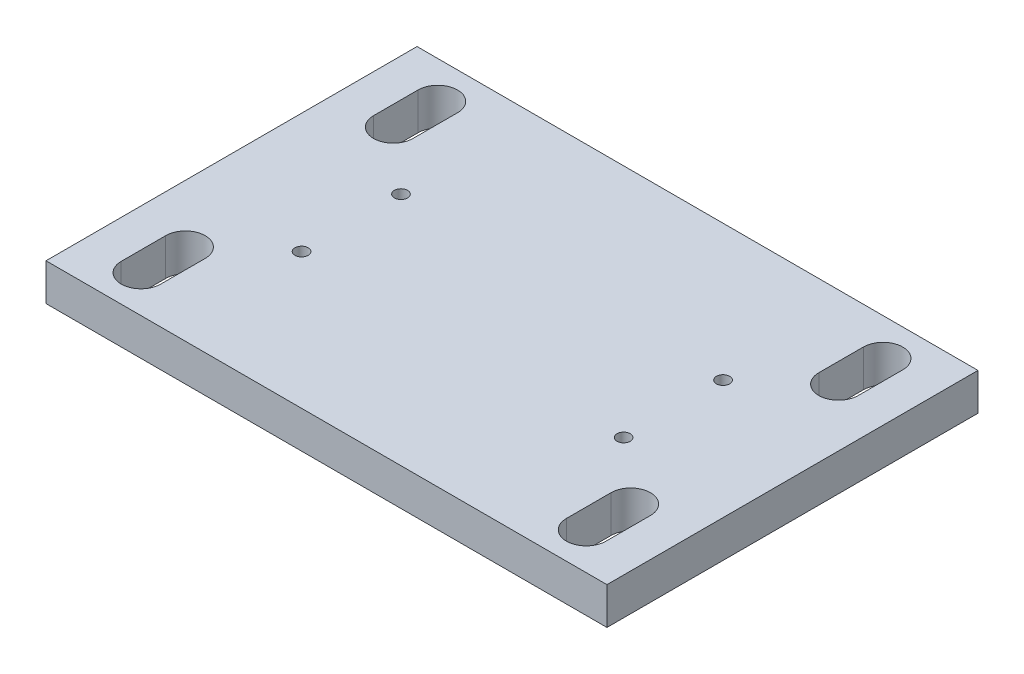
ISO-10303-21;
HEADER;
FILE_DESCRIPTION(('STEP AP214'),'2;1');
FILE_NAME('part.step','',(''),(''),'','','');
FILE_SCHEMA(('AUTOMOTIVE_DESIGN { 1 0 10303 214 1 1 1 1 }'));
ENDSEC;
DATA;
#1=APPLICATION_CONTEXT('core data for automotive mechanical design processes');
#2=APPLICATION_PROTOCOL_DEFINITION('international standard','automotive_design',2000,#1);
#3=PRODUCT_CONTEXT('',#1,'mechanical');
#4=PRODUCT('Part','Part','',(#3));
#5=PRODUCT_RELATED_PRODUCT_CATEGORY('part','',(#4));
#6=PRODUCT_DEFINITION_FORMATION('','',#4);
#7=PRODUCT_DEFINITION_CONTEXT('part definition',#1,'design');
#8=PRODUCT_DEFINITION('design','',#6,#7);
#9=PRODUCT_DEFINITION_SHAPE('','',#8);
#10=(LENGTH_UNIT() NAMED_UNIT(*) SI_UNIT(.MILLI.,.METRE.));
#11=(NAMED_UNIT(*) PLANE_ANGLE_UNIT() SI_UNIT($,.RADIAN.));
#12=(NAMED_UNIT(*) SI_UNIT($,.STERADIAN.) SOLID_ANGLE_UNIT());
#13=UNCERTAINTY_MEASURE_WITH_UNIT(LENGTH_MEASURE(1.E-05),#10,'distance_accuracy_value','');
#14=(GEOMETRIC_REPRESENTATION_CONTEXT(3) GLOBAL_UNCERTAINTY_ASSIGNED_CONTEXT((#13)) GLOBAL_UNIT_ASSIGNED_CONTEXT((#10,
#11,#12)) REPRESENTATION_CONTEXT('',''));
#15=CARTESIAN_POINT('',(0.,0.,0.));
#16=DIRECTION('',(0.,0.,1.));
#17=DIRECTION('',(1.,0.,0.));
#18=AXIS2_PLACEMENT_3D('',#15,#16,#17);
#19=CARTESIAN_POINT('',(-48.,6.35,-31.75));
#20=DIRECTION('',(1.,0.,0.));
#21=DIRECTION('',(0.,0.,-1.));
#22=AXIS2_PLACEMENT_3D('',#19,#20,#21);
#23=PLANE('',#22);
#24=DIRECTION('',(0.,0.,1.));
#25=VECTOR('',#24,1.);
#26=CARTESIAN_POINT('',(-48.,0.,-31.75));
#27=LINE('',#26,#25);
#28=CARTESIAN_POINT('',(-48.,0.,-31.75));
#29=VERTEX_POINT('',#28);
#30=CARTESIAN_POINT('',(-48.,0.,31.75));
#31=VERTEX_POINT('',#30);
#32=EDGE_CURVE('E395',#29,#31,#27,.T.);
#33=ORIENTED_EDGE('',*,*,#32,.T.);
#34=DIRECTION('',(0.,-1.,0.));
#35=VECTOR('',#34,1.);
#36=CARTESIAN_POINT('',(-48.,6.35,31.75));
#37=LINE('',#36,#35);
#38=CARTESIAN_POINT('',(-48.,6.35,31.75));
#39=VERTEX_POINT('',#38);
#40=EDGE_CURVE('E11',#39,#31,#37,.T.);
#41=ORIENTED_EDGE('',*,*,#40,.F.);
#42=DIRECTION('',(0.,0.,1.));
#43=VECTOR('',#42,1.);
#44=CARTESIAN_POINT('',(-48.,6.35,-31.75));
#45=LINE('',#44,#43);
#46=CARTESIAN_POINT('',(-48.,6.35,-31.75));
#47=VERTEX_POINT('',#46);
#48=EDGE_CURVE('E396',#47,#39,#45,.T.);
#49=ORIENTED_EDGE('',*,*,#48,.F.);
#50=DIRECTION('',(0.,-1.,0.));
#51=VECTOR('',#50,1.);
#52=CARTESIAN_POINT('',(-48.,6.35,-31.75));
#53=LINE('',#52,#51);
#54=EDGE_CURVE('E410',#47,#29,#53,.T.);
#55=ORIENTED_EDGE('',*,*,#54,.T.);
#56=EDGE_LOOP('',(#33,#41,#49,#55));
#57=FACE_BOUND('',#56,.T.);
#58=ADVANCED_FACE('F43',(#57),#23,.F.);
#59=CARTESIAN_POINT('',(-48.,6.35,31.75));
#60=DIRECTION('',(0.,0.,-1.));
#61=DIRECTION('',(-1.,0.,0.));
#62=AXIS2_PLACEMENT_3D('',#59,#60,#61);
#63=PLANE('',#62);
#64=DIRECTION('',(1.,0.,0.));
#65=VECTOR('',#64,1.);
#66=CARTESIAN_POINT('',(-48.,0.,31.75));
#67=LINE('',#66,#65);
#68=CARTESIAN_POINT('',(48.,0.,31.75));
#69=VERTEX_POINT('',#68);
#70=EDGE_CURVE('E414',#31,#69,#67,.T.);
#71=ORIENTED_EDGE('',*,*,#70,.T.);
#72=DIRECTION('',(0.,-1.,0.));
#73=VECTOR('',#72,1.);
#74=CARTESIAN_POINT('',(48.,6.35,31.75));
#75=LINE('',#74,#73);
#76=CARTESIAN_POINT('',(48.,6.35,31.75));
#77=VERTEX_POINT('',#76);
#78=EDGE_CURVE('E51',#77,#69,#75,.T.);
#79=ORIENTED_EDGE('',*,*,#78,.F.);
#80=DIRECTION('',(1.,0.,0.));
#81=VECTOR('',#80,1.);
#82=CARTESIAN_POINT('',(-48.,6.35,31.75));
#83=LINE('',#82,#81);
#84=EDGE_CURVE('E400',#39,#77,#83,.T.);
#85=ORIENTED_EDGE('',*,*,#84,.F.);
#86=ORIENTED_EDGE('',*,*,#40,.T.);
#87=EDGE_LOOP('',(#71,#79,#85,#86));
#88=FACE_BOUND('',#87,.T.);
#89=ADVANCED_FACE('F449',(#88),#63,.F.);
#90=CARTESIAN_POINT('',(48.,6.35,-31.75));
#91=DIRECTION('',(-1.,0.,0.));
#92=DIRECTION('',(0.,0.,1.));
#93=AXIS2_PLACEMENT_3D('',#90,#91,#92);
#94=PLANE('',#93);
#95=DIRECTION('',(0.,0.,-1.));
#96=VECTOR('',#95,1.);
#97=CARTESIAN_POINT('',(48.,0.,-31.75));
#98=LINE('',#97,#96);
#99=CARTESIAN_POINT('',(48.,0.,-31.75));
#100=VERTEX_POINT('',#99);
#101=EDGE_CURVE('E417',#69,#100,#98,.T.);
#102=ORIENTED_EDGE('',*,*,#101,.T.);
#103=DIRECTION('',(0.,-1.,0.));
#104=VECTOR('',#103,1.);
#105=CARTESIAN_POINT('',(48.,6.35,-31.75));
#106=LINE('',#105,#104);
#107=CARTESIAN_POINT('',(48.,6.35,-31.75));
#108=VERTEX_POINT('',#107);
#109=EDGE_CURVE('E425',#108,#100,#106,.T.);
#110=ORIENTED_EDGE('',*,*,#109,.F.);
#111=DIRECTION('',(0.,0.,-1.));
#112=VECTOR('',#111,1.);
#113=CARTESIAN_POINT('',(48.,6.35,-31.75));
#114=LINE('',#113,#112);
#115=EDGE_CURVE('E404',#77,#108,#114,.T.);
#116=ORIENTED_EDGE('',*,*,#115,.F.);
#117=ORIENTED_EDGE('',*,*,#78,.T.);
#118=EDGE_LOOP('',(#102,#110,#116,#117));
#119=FACE_BOUND('',#118,.T.);
#120=ADVANCED_FACE('F434',(#119),#94,.F.);
#121=CARTESIAN_POINT('',(-48.,6.35,-31.75));
#122=DIRECTION('',(0.,0.,1.));
#123=DIRECTION('',(1.,0.,0.));
#124=AXIS2_PLACEMENT_3D('',#121,#122,#123);
#125=PLANE('',#124);
#126=DIRECTION('',(-1.,0.,0.));
#127=VECTOR('',#126,1.);
#128=CARTESIAN_POINT('',(-48.,0.,-31.75));
#129=LINE('',#128,#127);
#130=EDGE_CURVE('E401',#100,#29,#129,.T.);
#131=ORIENTED_EDGE('',*,*,#130,.T.);
#132=ORIENTED_EDGE('',*,*,#54,.F.);
#133=DIRECTION('',(-1.,0.,0.));
#134=VECTOR('',#133,1.);
#135=CARTESIAN_POINT('',(-48.,6.35,-31.75));
#136=LINE('',#135,#134);
#137=EDGE_CURVE('E407',#108,#47,#136,.T.);
#138=ORIENTED_EDGE('',*,*,#137,.F.);
#139=ORIENTED_EDGE('',*,*,#109,.T.);
#140=EDGE_LOOP('',(#131,#132,#138,#139));
#141=FACE_BOUND('',#140,.T.);
#142=ADVANCED_FACE('F442',(#141),#125,.F.);
#143=CARTESIAN_POINT('',(0.,6.35,0.));
#144=DIRECTION('',(0.,1.,0.));
#145=DIRECTION('',(0.,0.,1.));
#146=AXIS2_PLACEMENT_3D('',#143,#144,#145);
#147=PLANE('',#146);
#148=CARTESIAN_POINT('',(-38.0999999999996,6.35,17.78));
#149=DIRECTION('',(0.,1.,0.));
#150=DIRECTION('',(0.,0.,1.));
#151=AXIS2_PLACEMENT_3D('',#148,#149,#150);
#152=CIRCLE('',#151,3.37820000000046);
#153=CARTESIAN_POINT('',(-34.7217999999995,6.35,17.78));
#154=VERTEX_POINT('',#153);
#155=CARTESIAN_POINT('',(-41.4782000000004,6.35,17.78));
#156=VERTEX_POINT('',#155);
#157=EDGE_CURVE('E58',#154,#156,#152,.T.);
#158=ORIENTED_EDGE('',*,*,#157,.F.);
#159=DIRECTION('',(0.,0.,-1.));
#160=VECTOR('',#159,1.);
#161=CARTESIAN_POINT('',(-34.7217999999995,6.35,17.78));
#162=LINE('',#161,#160);
#163=CARTESIAN_POINT('',(-34.7217999999995,6.35,25.4));
#164=VERTEX_POINT('',#163);
#165=EDGE_CURVE('E284',#164,#154,#162,.T.);
#166=ORIENTED_EDGE('',*,*,#165,.F.);
#167=CARTESIAN_POINT('',(-38.0999999999996,6.35,25.4));
#168=DIRECTION('',(0.,1.,0.));
#169=DIRECTION('',(0.,0.,1.));
#170=AXIS2_PLACEMENT_3D('',#167,#168,#169);
#171=CIRCLE('',#170,3.37820000000046);
#172=CARTESIAN_POINT('',(-41.4782,6.35,25.4));
#173=VERTEX_POINT('',#172);
#174=EDGE_CURVE('E303',#173,#164,#171,.T.);
#175=ORIENTED_EDGE('',*,*,#174,.F.);
#176=DIRECTION('',(0.,0.,1.));
#177=VECTOR('',#176,1.);
#178=CARTESIAN_POINT('',(-41.4782000000004,6.35,17.78));
#179=LINE('',#178,#177);
#180=EDGE_CURVE('E299',#156,#173,#179,.T.);
#181=ORIENTED_EDGE('',*,*,#180,.F.);
#182=EDGE_LOOP('',(#158,#166,#175,#181));
#183=FACE_BOUND('',#182,.T.);
#184=CARTESIAN_POINT('',(38.1000000000004,6.35,17.78));
#185=DIRECTION('',(0.,1.,0.));
#186=DIRECTION('',(0.,0.,1.));
#187=AXIS2_PLACEMENT_3D('',#184,#185,#186);
#188=CIRCLE('',#187,3.37820000000045);
#189=CARTESIAN_POINT('',(41.4782000000005,6.35,17.78));
#190=VERTEX_POINT('',#189);
#191=CARTESIAN_POINT('',(34.7217999999996,6.35,17.78));
#192=VERTEX_POINT('',#191);
#193=EDGE_CURVE('E66',#190,#192,#188,.T.);
#194=ORIENTED_EDGE('',*,*,#193,.F.);
#195=DIRECTION('',(0.,0.,-1.));
#196=VECTOR('',#195,1.);
#197=CARTESIAN_POINT('',(41.4782000000005,6.35,17.78));
#198=LINE('',#197,#196);
#199=CARTESIAN_POINT('',(41.4782000000005,6.35,25.4));
#200=VERTEX_POINT('',#199);
#201=EDGE_CURVE('E242',#200,#190,#198,.T.);
#202=ORIENTED_EDGE('',*,*,#201,.F.);
#203=CARTESIAN_POINT('',(38.1000000000004,6.35,25.4));
#204=DIRECTION('',(0.,1.,0.));
#205=DIRECTION('',(0.,0.,1.));
#206=AXIS2_PLACEMENT_3D('',#203,#204,#205);
#207=CIRCLE('',#206,3.37820000000045);
#208=CARTESIAN_POINT('',(34.7218,6.35,25.4));
#209=VERTEX_POINT('',#208);
#210=EDGE_CURVE('E262',#209,#200,#207,.T.);
#211=ORIENTED_EDGE('',*,*,#210,.F.);
#212=DIRECTION('',(0.,0.,1.));
#213=VECTOR('',#212,1.);
#214=CARTESIAN_POINT('',(34.7217999999996,6.35,17.78));
#215=LINE('',#214,#213);
#216=EDGE_CURVE('E257',#192,#209,#215,.T.);
#217=ORIENTED_EDGE('',*,*,#216,.F.);
#218=EDGE_LOOP('',(#194,#202,#211,#217));
#219=FACE_BOUND('',#218,.T.);
#220=CARTESIAN_POINT('',(38.1,6.35,-25.4));
#221=DIRECTION('',(0.,1.,0.));
#222=DIRECTION('',(0.,0.,1.));
#223=AXIS2_PLACEMENT_3D('',#220,#221,#222);
#224=CIRCLE('',#223,3.37820000000001);
#225=CARTESIAN_POINT('',(41.4782,6.35,-25.4));
#226=VERTEX_POINT('',#225);
#227=CARTESIAN_POINT('',(34.7218,6.35,-25.4));
#228=VERTEX_POINT('',#227);
#229=EDGE_CURVE('E187',#226,#228,#224,.T.);
#230=ORIENTED_EDGE('',*,*,#229,.F.);
#231=DIRECTION('',(0.,0.,-1.));
#232=VECTOR('',#231,1.);
#233=CARTESIAN_POINT('',(41.4782,6.35,-25.4));
#234=LINE('',#233,#232);
#235=CARTESIAN_POINT('',(41.4782,6.35,-17.78));
#236=VERTEX_POINT('',#235);
#237=EDGE_CURVE('E208',#236,#226,#234,.T.);
#238=ORIENTED_EDGE('',*,*,#237,.F.);
#239=CARTESIAN_POINT('',(38.1,6.35,-17.78));
#240=DIRECTION('',(0.,1.,0.));
#241=DIRECTION('',(0.,0.,1.));
#242=AXIS2_PLACEMENT_3D('',#239,#240,#241);
#243=CIRCLE('',#242,3.37820000000001);
#244=CARTESIAN_POINT('',(34.7218,6.35,-17.78));
#245=VERTEX_POINT('',#244);
#246=EDGE_CURVE('E212',#245,#236,#243,.T.);
#247=ORIENTED_EDGE('',*,*,#246,.F.);
#248=DIRECTION('',(0.,0.,1.));
#249=VECTOR('',#248,1.);
#250=CARTESIAN_POINT('',(34.7218,6.35,-25.4));
#251=LINE('',#250,#249);
#252=EDGE_CURVE('E221',#228,#245,#251,.T.);
#253=ORIENTED_EDGE('',*,*,#252,.F.);
#254=EDGE_LOOP('',(#230,#238,#247,#253));
#255=FACE_BOUND('',#254,.T.);
#256=CARTESIAN_POINT('',(-38.1,6.35,-25.4));
#257=DIRECTION('',(0.,1.,0.));
#258=DIRECTION('',(0.,0.,1.));
#259=AXIS2_PLACEMENT_3D('',#256,#257,#258);
#260=CIRCLE('',#259,3.37820000000001);
#261=CARTESIAN_POINT('',(-34.7218,6.35,-25.4));
#262=VERTEX_POINT('',#261);
#263=CARTESIAN_POINT('',(-41.4782,6.35,-25.4));
#264=VERTEX_POINT('',#263);
#265=EDGE_CURVE('E231',#262,#264,#260,.T.);
#266=ORIENTED_EDGE('',*,*,#265,.F.);
#267=DIRECTION('',(0.,0.,-1.));
#268=VECTOR('',#267,1.);
#269=CARTESIAN_POINT('',(-34.7218,6.35,-25.4));
#270=LINE('',#269,#268);
#271=CARTESIAN_POINT('',(-34.7218,6.35,-17.78));
#272=VERTEX_POINT('',#271);
#273=EDGE_CURVE('E325',#272,#262,#270,.T.);
#274=ORIENTED_EDGE('',*,*,#273,.F.);
#275=CARTESIAN_POINT('',(-38.1,6.35,-17.78));
#276=DIRECTION('',(0.,1.,0.));
#277=DIRECTION('',(0.,0.,1.));
#278=AXIS2_PLACEMENT_3D('',#275,#276,#277);
#279=CIRCLE('',#278,3.37820000000001);
#280=CARTESIAN_POINT('',(-41.4782,6.35,-17.78));
#281=VERTEX_POINT('',#280);
#282=EDGE_CURVE('E344',#281,#272,#279,.T.);
#283=ORIENTED_EDGE('',*,*,#282,.F.);
#284=DIRECTION('',(0.,0.,1.));
#285=VECTOR('',#284,1.);
#286=CARTESIAN_POINT('',(-41.4782,6.35,-25.4));
#287=LINE('',#286,#285);
#288=EDGE_CURVE('E340',#264,#281,#287,.T.);
#289=ORIENTED_EDGE('',*,*,#288,.F.);
#290=EDGE_LOOP('',(#266,#274,#283,#289));
#291=FACE_BOUND('',#290,.T.);
#292=CARTESIAN_POINT('',(-27.5,6.35,-8.5));
#293=DIRECTION('',(0.,1.,0.));
#294=DIRECTION('',(0.,0.,1.));
#295=AXIS2_PLACEMENT_3D('',#292,#293,#294);
#296=CIRCLE('',#295,1.1303);
#297=CARTESIAN_POINT('',(-27.5,6.35,-7.3697));
#298=VERTEX_POINT('',#297);
#299=EDGE_CURVE('E354',#298,#298,#296,.T.);
#300=ORIENTED_EDGE('',*,*,#299,.F.);
#301=EDGE_LOOP('',(#300));
#302=FACE_BOUND('',#301,.T.);
#303=CARTESIAN_POINT('',(27.618,6.35,-8.5));
#304=DIRECTION('',(0.,1.,0.));
#305=DIRECTION('',(0.,0.,1.));
#306=AXIS2_PLACEMENT_3D('',#303,#304,#305);
#307=CIRCLE('',#306,1.1303);
#308=CARTESIAN_POINT('',(27.618,6.35,-7.3697));
#309=VERTEX_POINT('',#308);
#310=EDGE_CURVE('E371',#309,#309,#307,.T.);
#311=ORIENTED_EDGE('',*,*,#310,.F.);
#312=EDGE_LOOP('',(#311));
#313=FACE_BOUND('',#312,.T.);
#314=CARTESIAN_POINT('',(27.6180000000002,6.35,8.518));
#315=DIRECTION('',(0.,1.,0.));
#316=DIRECTION('',(0.,0.,1.));
#317=AXIS2_PLACEMENT_3D('',#314,#315,#316);
#318=CIRCLE('',#317,1.1303);
#319=CARTESIAN_POINT('',(27.6180000000002,6.35,9.6483));
#320=VERTEX_POINT('',#319);
#321=EDGE_CURVE('E379',#320,#320,#318,.T.);
#322=ORIENTED_EDGE('',*,*,#321,.F.);
#323=EDGE_LOOP('',(#322));
#324=FACE_BOUND('',#323,.T.);
#325=CARTESIAN_POINT('',(-27.4999999999998,6.35,8.518));
#326=DIRECTION('',(0.,1.,0.));
#327=DIRECTION('',(0.,0.,1.));
#328=AXIS2_PLACEMENT_3D('',#325,#326,#327);
#329=CIRCLE('',#328,1.1303);
#330=CARTESIAN_POINT('',(-27.4999999999998,6.35,9.6483));
#331=VERTEX_POINT('',#330);
#332=EDGE_CURVE('E387',#331,#331,#329,.T.);
#333=ORIENTED_EDGE('',*,*,#332,.F.);
#334=EDGE_LOOP('',(#333));
#335=FACE_BOUND('',#334,.T.);
#336=ORIENTED_EDGE('',*,*,#48,.T.);
#337=ORIENTED_EDGE('',*,*,#84,.T.);
#338=ORIENTED_EDGE('',*,*,#115,.T.);
#339=ORIENTED_EDGE('',*,*,#137,.T.);
#340=EDGE_LOOP('',(#336,#337,#338,#339));
#341=FACE_BOUND('',#340,.T.);
#342=ADVANCED_FACE('F448',(#183,#219,#255,#291,#302,#313,#324,#335,#341),#147,.T.);
#343=CARTESIAN_POINT('',(0.,0.,0.));
#344=DIRECTION('',(0.,1.,0.));
#345=DIRECTION('',(0.,0.,1.));
#346=AXIS2_PLACEMENT_3D('',#343,#344,#345);
#347=PLANE('',#346);
#348=DIRECTION('',(0.,0.,-1.));
#349=VECTOR('',#348,1.);
#350=CARTESIAN_POINT('',(-34.7217999999995,0.,17.78));
#351=LINE('',#350,#349);
#352=CARTESIAN_POINT('',(-34.7217999999995,0.,25.4));
#353=VERTEX_POINT('',#352);
#354=CARTESIAN_POINT('',(-34.7217999999995,0.,17.78));
#355=VERTEX_POINT('',#354);
#356=EDGE_CURVE('E292',#353,#355,#351,.T.);
#357=ORIENTED_EDGE('',*,*,#356,.T.);
#358=CARTESIAN_POINT('',(-38.0999999999996,0.,17.78));
#359=DIRECTION('',(0.,1.,0.));
#360=DIRECTION('',(0.,0.,1.));
#361=AXIS2_PLACEMENT_3D('',#358,#359,#360);
#362=CIRCLE('',#361,3.37820000000046);
#363=CARTESIAN_POINT('',(-41.4782000000004,0.,17.78));
#364=VERTEX_POINT('',#363);
#365=EDGE_CURVE('E279',#355,#364,#362,.T.);
#366=ORIENTED_EDGE('',*,*,#365,.T.);
#367=DIRECTION('',(0.,0.,1.));
#368=VECTOR('',#367,1.);
#369=CARTESIAN_POINT('',(-41.4782000000004,0.,17.78));
#370=LINE('',#369,#368);
#371=CARTESIAN_POINT('',(-41.4782000000004,0.,25.4));
#372=VERTEX_POINT('',#371);
#373=EDGE_CURVE('E283',#364,#372,#370,.T.);
#374=ORIENTED_EDGE('',*,*,#373,.T.);
#375=CARTESIAN_POINT('',(-38.0999999999996,0.,25.4));
#376=DIRECTION('',(0.,1.,0.));
#377=DIRECTION('',(0.,0.,1.));
#378=AXIS2_PLACEMENT_3D('',#375,#376,#377);
#379=CIRCLE('',#378,3.37820000000046);
#380=EDGE_CURVE('E288',#372,#353,#379,.T.);
#381=ORIENTED_EDGE('',*,*,#380,.T.);
#382=EDGE_LOOP('',(#357,#366,#374,#381));
#383=FACE_BOUND('',#382,.T.);
#384=DIRECTION('',(0.,0.,-1.));
#385=VECTOR('',#384,1.);
#386=CARTESIAN_POINT('',(41.4782000000005,0.,17.78));
#387=LINE('',#386,#385);
#388=CARTESIAN_POINT('',(41.4782000000005,0.,25.4));
#389=VERTEX_POINT('',#388);
#390=CARTESIAN_POINT('',(41.4782000000005,0.,17.78));
#391=VERTEX_POINT('',#390);
#392=EDGE_CURVE('E250',#389,#391,#387,.T.);
#393=ORIENTED_EDGE('',*,*,#392,.T.);
#394=CARTESIAN_POINT('',(38.1000000000004,0.,17.78));
#395=DIRECTION('',(0.,1.,0.));
#396=DIRECTION('',(0.,0.,1.));
#397=AXIS2_PLACEMENT_3D('',#394,#395,#396);
#398=CIRCLE('',#397,3.37820000000045);
#399=CARTESIAN_POINT('',(34.7217999999996,0.,17.78));
#400=VERTEX_POINT('',#399);
#401=EDGE_CURVE('E237',#391,#400,#398,.T.);
#402=ORIENTED_EDGE('',*,*,#401,.T.);
#403=DIRECTION('',(0.,0.,1.));
#404=VECTOR('',#403,1.);
#405=CARTESIAN_POINT('',(34.7217999999996,0.,17.78));
#406=LINE('',#405,#404);
#407=CARTESIAN_POINT('',(34.7217999999996,0.,25.4));
#408=VERTEX_POINT('',#407);
#409=EDGE_CURVE('E241',#400,#408,#406,.T.);
#410=ORIENTED_EDGE('',*,*,#409,.T.);
#411=CARTESIAN_POINT('',(38.1000000000004,0.,25.4));
#412=DIRECTION('',(0.,1.,0.));
#413=DIRECTION('',(0.,0.,1.));
#414=AXIS2_PLACEMENT_3D('',#411,#412,#413);
#415=CIRCLE('',#414,3.37820000000045);
#416=EDGE_CURVE('E246',#408,#389,#415,.T.);
#417=ORIENTED_EDGE('',*,*,#416,.T.);
#418=EDGE_LOOP('',(#393,#402,#410,#417));
#419=FACE_BOUND('',#418,.T.);
#420=DIRECTION('',(0.,0.,-1.));
#421=VECTOR('',#420,1.);
#422=CARTESIAN_POINT('',(41.4782,0.,-25.4));
#423=LINE('',#422,#421);
#424=CARTESIAN_POINT('',(41.4782,0.,-17.78));
#425=VERTEX_POINT('',#424);
#426=CARTESIAN_POINT('',(41.4782,0.,-25.4));
#427=VERTEX_POINT('',#426);
#428=EDGE_CURVE('E193',#425,#427,#423,.T.);
#429=ORIENTED_EDGE('',*,*,#428,.T.);
#430=CARTESIAN_POINT('',(38.1,0.,-25.4));
#431=DIRECTION('',(0.,1.,0.));
#432=DIRECTION('',(0.,0.,1.));
#433=AXIS2_PLACEMENT_3D('',#430,#431,#432);
#434=CIRCLE('',#433,3.37820000000001);
#435=CARTESIAN_POINT('',(34.7218,0.,-25.4));
#436=VERTEX_POINT('',#435);
#437=EDGE_CURVE('E184',#427,#436,#434,.T.);
#438=ORIENTED_EDGE('',*,*,#437,.T.);
#439=DIRECTION('',(0.,0.,1.));
#440=VECTOR('',#439,1.);
#441=CARTESIAN_POINT('',(34.7218,0.,-25.4));
#442=LINE('',#441,#440);
#443=CARTESIAN_POINT('',(34.7218,0.,-17.78));
#444=VERTEX_POINT('',#443);
#445=EDGE_CURVE('E197',#436,#444,#442,.T.);
#446=ORIENTED_EDGE('',*,*,#445,.T.);
#447=CARTESIAN_POINT('',(38.1,0.,-17.78));
#448=DIRECTION('',(0.,1.,0.));
#449=DIRECTION('',(0.,0.,1.));
#450=AXIS2_PLACEMENT_3D('',#447,#448,#449);
#451=CIRCLE('',#450,3.37820000000001);
#452=EDGE_CURVE('E202',#444,#425,#451,.T.);
#453=ORIENTED_EDGE('',*,*,#452,.T.);
#454=EDGE_LOOP('',(#429,#438,#446,#453));
#455=FACE_BOUND('',#454,.T.);
#456=DIRECTION('',(0.,0.,-1.));
#457=VECTOR('',#456,1.);
#458=CARTESIAN_POINT('',(-34.7218,0.,-25.4));
#459=LINE('',#458,#457);
#460=CARTESIAN_POINT('',(-34.7218,0.,-17.78));
#461=VERTEX_POINT('',#460);
#462=CARTESIAN_POINT('',(-34.7218,0.,-25.4));
#463=VERTEX_POINT('',#462);
#464=EDGE_CURVE('E333',#461,#463,#459,.T.);
#465=ORIENTED_EDGE('',*,*,#464,.T.);
#466=CARTESIAN_POINT('',(-38.1,0.,-25.4));
#467=DIRECTION('',(0.,1.,0.));
#468=DIRECTION('',(0.,0.,1.));
#469=AXIS2_PLACEMENT_3D('',#466,#467,#468);
#470=CIRCLE('',#469,3.37820000000001);
#471=CARTESIAN_POINT('',(-41.4782,0.,-25.4));
#472=VERTEX_POINT('',#471);
#473=EDGE_CURVE('E320',#463,#472,#470,.T.);
#474=ORIENTED_EDGE('',*,*,#473,.T.);
#475=DIRECTION('',(0.,0.,1.));
#476=VECTOR('',#475,1.);
#477=CARTESIAN_POINT('',(-41.4782,0.,-25.4));
#478=LINE('',#477,#476);
#479=CARTESIAN_POINT('',(-41.4782,0.,-17.78));
#480=VERTEX_POINT('',#479);
#481=EDGE_CURVE('E324',#472,#480,#478,.T.);
#482=ORIENTED_EDGE('',*,*,#481,.T.);
#483=CARTESIAN_POINT('',(-38.1,0.,-17.78));
#484=DIRECTION('',(0.,1.,0.));
#485=DIRECTION('',(0.,0.,1.));
#486=AXIS2_PLACEMENT_3D('',#483,#484,#485);
#487=CIRCLE('',#486,3.37820000000001);
#488=EDGE_CURVE('E329',#480,#461,#487,.T.);
#489=ORIENTED_EDGE('',*,*,#488,.T.);
#490=EDGE_LOOP('',(#465,#474,#482,#489));
#491=FACE_BOUND('',#490,.T.);
#492=CARTESIAN_POINT('',(-27.5,0.,-8.5));
#493=DIRECTION('',(0.,1.,0.));
#494=DIRECTION('',(0.,0.,1.));
#495=AXIS2_PLACEMENT_3D('',#492,#493,#494);
#496=CIRCLE('',#495,1.1303);
#497=CARTESIAN_POINT('',(-27.5,0.,-7.3697));
#498=VERTEX_POINT('',#497);
#499=EDGE_CURVE('E367',#498,#498,#496,.T.);
#500=ORIENTED_EDGE('',*,*,#499,.T.);
#501=EDGE_LOOP('',(#500));
#502=FACE_BOUND('',#501,.T.);
#503=CARTESIAN_POINT('',(27.618,0.,-8.5));
#504=DIRECTION('',(0.,1.,0.));
#505=DIRECTION('',(0.,0.,1.));
#506=AXIS2_PLACEMENT_3D('',#503,#504,#505);
#507=CIRCLE('',#506,1.1303);
#508=CARTESIAN_POINT('',(27.618,0.,-7.3697));
#509=VERTEX_POINT('',#508);
#510=EDGE_CURVE('E375',#509,#509,#507,.T.);
#511=ORIENTED_EDGE('',*,*,#510,.T.);
#512=EDGE_LOOP('',(#511));
#513=FACE_BOUND('',#512,.T.);
#514=CARTESIAN_POINT('',(27.6180000000002,0.,8.518));
#515=DIRECTION('',(0.,1.,0.));
#516=DIRECTION('',(0.,0.,1.));
#517=AXIS2_PLACEMENT_3D('',#514,#515,#516);
#518=CIRCLE('',#517,1.1303);
#519=CARTESIAN_POINT('',(27.6180000000002,0.,9.6483));
#520=VERTEX_POINT('',#519);
#521=EDGE_CURVE('E383',#520,#520,#518,.T.);
#522=ORIENTED_EDGE('',*,*,#521,.T.);
#523=EDGE_LOOP('',(#522));
#524=FACE_BOUND('',#523,.T.);
#525=CARTESIAN_POINT('',(-27.4999999999998,0.,8.518));
#526=DIRECTION('',(0.,1.,0.));
#527=DIRECTION('',(0.,0.,1.));
#528=AXIS2_PLACEMENT_3D('',#525,#526,#527);
#529=CIRCLE('',#528,1.1303);
#530=CARTESIAN_POINT('',(-27.4999999999998,0.,9.6483));
#531=VERTEX_POINT('',#530);
#532=EDGE_CURVE('E391',#531,#531,#529,.T.);
#533=ORIENTED_EDGE('',*,*,#532,.T.);
#534=EDGE_LOOP('',(#533));
#535=FACE_BOUND('',#534,.T.);
#536=ORIENTED_EDGE('',*,*,#32,.F.);
#537=ORIENTED_EDGE('',*,*,#130,.F.);
#538=ORIENTED_EDGE('',*,*,#101,.F.);
#539=ORIENTED_EDGE('',*,*,#70,.F.);
#540=EDGE_LOOP('',(#536,#537,#538,#539));
#541=FACE_BOUND('',#540,.T.);
#542=ADVANCED_FACE('F204',(#383,#419,#455,#491,#502,#513,#524,#535,#541),#347,.F.);
#543=CARTESIAN_POINT('',(-27.4999999999998,6.35,8.518));
#544=DIRECTION('',(0.,1.,0.));
#545=DIRECTION('',(0.,0.,1.));
#546=AXIS2_PLACEMENT_3D('',#543,#544,#545);
#547=CYLINDRICAL_SURFACE('',#546,1.1303);
#548=ORIENTED_EDGE('',*,*,#532,.F.);
#549=EDGE_LOOP('',(#548));
#550=FACE_BOUND('',#549,.T.);
#551=ORIENTED_EDGE('',*,*,#332,.T.);
#552=EDGE_LOOP('',(#551));
#553=FACE_BOUND('',#552,.T.);
#554=ADVANCED_FACE('F461',(#550,#553),#547,.F.);
#555=CARTESIAN_POINT('',(27.6180000000002,6.35,8.518));
#556=DIRECTION('',(0.,1.,0.));
#557=DIRECTION('',(0.,0.,1.));
#558=AXIS2_PLACEMENT_3D('',#555,#556,#557);
#559=CYLINDRICAL_SURFACE('',#558,1.1303);
#560=ORIENTED_EDGE('',*,*,#521,.F.);
#561=EDGE_LOOP('',(#560));
#562=FACE_BOUND('',#561,.T.);
#563=ORIENTED_EDGE('',*,*,#321,.T.);
#564=EDGE_LOOP('',(#563));
#565=FACE_BOUND('',#564,.T.);
#566=ADVANCED_FACE('F468',(#562,#565),#559,.F.);
#567=CARTESIAN_POINT('',(27.618,6.35,-8.5));
#568=DIRECTION('',(0.,1.,0.));
#569=DIRECTION('',(0.,0.,1.));
#570=AXIS2_PLACEMENT_3D('',#567,#568,#569);
#571=CYLINDRICAL_SURFACE('',#570,1.1303);
#572=ORIENTED_EDGE('',*,*,#510,.F.);
#573=EDGE_LOOP('',(#572));
#574=FACE_BOUND('',#573,.T.);
#575=ORIENTED_EDGE('',*,*,#310,.T.);
#576=EDGE_LOOP('',(#575));
#577=FACE_BOUND('',#576,.T.);
#578=ADVANCED_FACE('F472',(#574,#577),#571,.F.);
#579=CARTESIAN_POINT('',(-27.5,6.35,-8.5));
#580=DIRECTION('',(0.,1.,0.));
#581=DIRECTION('',(0.,0.,1.));
#582=AXIS2_PLACEMENT_3D('',#579,#580,#581);
#583=CYLINDRICAL_SURFACE('',#582,1.1303);
#584=ORIENTED_EDGE('',*,*,#499,.F.);
#585=EDGE_LOOP('',(#584));
#586=FACE_BOUND('',#585,.T.);
#587=ORIENTED_EDGE('',*,*,#299,.T.);
#588=EDGE_LOOP('',(#587));
#589=FACE_BOUND('',#588,.T.);
#590=ADVANCED_FACE('F476',(#586,#589),#583,.F.);
#591=CARTESIAN_POINT('',(-38.1,0.,-25.4));
#592=DIRECTION('',(0.,1.,0.));
#593=DIRECTION('',(0.,0.,1.));
#594=AXIS2_PLACEMENT_3D('',#591,#592,#593);
#595=CYLINDRICAL_SURFACE('',#594,3.37820000000001);
#596=ORIENTED_EDGE('',*,*,#265,.T.);
#597=DIRECTION('',(0.,1.,0.));
#598=VECTOR('',#597,1.);
#599=CARTESIAN_POINT('',(-41.4782,0.,-25.4));
#600=LINE('',#599,#598);
#601=EDGE_CURVE('E337',#472,#264,#600,.T.);
#602=ORIENTED_EDGE('',*,*,#601,.F.);
#603=ORIENTED_EDGE('',*,*,#473,.F.);
#604=DIRECTION('',(0.,1.,0.));
#605=VECTOR('',#604,1.);
#606=CARTESIAN_POINT('',(-34.7218,0.,-25.4));
#607=LINE('',#606,#605);
#608=EDGE_CURVE('E351',#463,#262,#607,.T.);
#609=ORIENTED_EDGE('',*,*,#608,.T.);
#610=EDGE_LOOP('',(#596,#602,#603,#609));
#611=FACE_BOUND('',#610,.T.);
#612=ADVANCED_FACE('F480',(#611),#595,.F.);
#613=CARTESIAN_POINT('',(-34.7218,0.,-25.4));
#614=DIRECTION('',(1.,0.,0.));
#615=DIRECTION('',(0.,0.,-1.));
#616=AXIS2_PLACEMENT_3D('',#613,#614,#615);
#617=PLANE('',#616);
#618=ORIENTED_EDGE('',*,*,#273,.T.);
#619=ORIENTED_EDGE('',*,*,#608,.F.);
#620=ORIENTED_EDGE('',*,*,#464,.F.);
#621=DIRECTION('',(0.,1.,0.));
#622=VECTOR('',#621,1.);
#623=CARTESIAN_POINT('',(-34.7218,0.,-17.78));
#624=LINE('',#623,#622);
#625=EDGE_CURVE('E355',#461,#272,#624,.T.);
#626=ORIENTED_EDGE('',*,*,#625,.T.);
#627=EDGE_LOOP('',(#618,#619,#620,#626));
#628=FACE_BOUND('',#627,.T.);
#629=ADVANCED_FACE('F484',(#628),#617,.F.);
#630=CARTESIAN_POINT('',(-38.1,0.,-17.78));
#631=DIRECTION('',(0.,1.,0.));
#632=DIRECTION('',(0.,0.,1.));
#633=AXIS2_PLACEMENT_3D('',#630,#631,#632);
#634=CYLINDRICAL_SURFACE('',#633,3.37820000000001);
#635=ORIENTED_EDGE('',*,*,#282,.T.);
#636=ORIENTED_EDGE('',*,*,#625,.F.);
#637=ORIENTED_EDGE('',*,*,#488,.F.);
#638=DIRECTION('',(0.,1.,0.));
#639=VECTOR('',#638,1.);
#640=CARTESIAN_POINT('',(-41.4782,0.,-17.78));
#641=LINE('',#640,#639);
#642=EDGE_CURVE('E358',#480,#281,#641,.T.);
#643=ORIENTED_EDGE('',*,*,#642,.T.);
#644=EDGE_LOOP('',(#635,#636,#637,#643));
#645=FACE_BOUND('',#644,.T.);
#646=ADVANCED_FACE('F489',(#645),#634,.F.);
#647=CARTESIAN_POINT('',(-41.4782,0.,-25.4));
#648=DIRECTION('',(-1.,0.,0.));
#649=DIRECTION('',(0.,0.,1.));
#650=AXIS2_PLACEMENT_3D('',#647,#648,#649);
#651=PLANE('',#650);
#652=ORIENTED_EDGE('',*,*,#288,.T.);
#653=ORIENTED_EDGE('',*,*,#642,.F.);
#654=ORIENTED_EDGE('',*,*,#481,.F.);
#655=ORIENTED_EDGE('',*,*,#601,.T.);
#656=EDGE_LOOP('',(#652,#653,#654,#655));
#657=FACE_BOUND('',#656,.T.);
#658=ADVANCED_FACE('F486',(#657),#651,.F.);
#659=CARTESIAN_POINT('',(38.1,0.,-25.4));
#660=DIRECTION('',(0.,1.,0.));
#661=DIRECTION('',(0.,0.,1.));
#662=AXIS2_PLACEMENT_3D('',#659,#660,#661);
#663=CYLINDRICAL_SURFACE('',#662,3.37820000000001);
#664=ORIENTED_EDGE('',*,*,#229,.T.);
#665=DIRECTION('',(0.,1.,0.));
#666=VECTOR('',#665,1.);
#667=CARTESIAN_POINT('',(34.7218,0.,-25.4));
#668=LINE('',#667,#666);
#669=EDGE_CURVE('E180',#436,#228,#668,.T.);
#670=ORIENTED_EDGE('',*,*,#669,.F.);
#671=ORIENTED_EDGE('',*,*,#437,.F.);
#672=DIRECTION('',(0.,1.,0.));
#673=VECTOR('',#672,1.);
#674=CARTESIAN_POINT('',(41.4782,0.,-25.4));
#675=LINE('',#674,#673);
#676=EDGE_CURVE('E228',#427,#226,#675,.T.);
#677=ORIENTED_EDGE('',*,*,#676,.T.);
#678=EDGE_LOOP('',(#664,#670,#671,#677));
#679=FACE_BOUND('',#678,.T.);
#680=ADVANCED_FACE('F182',(#679),#663,.F.);
#681=CARTESIAN_POINT('',(41.4782,0.,-25.4));
#682=DIRECTION('',(1.,0.,0.));
#683=DIRECTION('',(0.,0.,-1.));
#684=AXIS2_PLACEMENT_3D('',#681,#682,#683);
#685=PLANE('',#684);
#686=ORIENTED_EDGE('',*,*,#237,.T.);
#687=ORIENTED_EDGE('',*,*,#676,.F.);
#688=ORIENTED_EDGE('',*,*,#428,.F.);
#689=DIRECTION('',(0.,1.,0.));
#690=VECTOR('',#689,1.);
#691=CARTESIAN_POINT('',(41.4782,0.,-17.78));
#692=LINE('',#691,#690);
#693=EDGE_CURVE('E232',#425,#236,#692,.T.);
#694=ORIENTED_EDGE('',*,*,#693,.T.);
#695=EDGE_LOOP('',(#686,#687,#688,#694));
#696=FACE_BOUND('',#695,.T.);
#697=ADVANCED_FACE('F529',(#696),#685,.F.);
#698=CARTESIAN_POINT('',(38.1,0.,-17.78));
#699=DIRECTION('',(0.,1.,0.));
#700=DIRECTION('',(0.,0.,1.));
#701=AXIS2_PLACEMENT_3D('',#698,#699,#700);
#702=CYLINDRICAL_SURFACE('',#701,3.37820000000001);
#703=ORIENTED_EDGE('',*,*,#246,.T.);
#704=ORIENTED_EDGE('',*,*,#693,.F.);
#705=ORIENTED_EDGE('',*,*,#452,.F.);
#706=DIRECTION('',(0.,1.,0.));
#707=VECTOR('',#706,1.);
#708=CARTESIAN_POINT('',(34.7218,0.,-17.78));
#709=LINE('',#708,#707);
#710=EDGE_CURVE('E192',#444,#245,#709,.T.);
#711=ORIENTED_EDGE('',*,*,#710,.T.);
#712=EDGE_LOOP('',(#703,#704,#705,#711));
#713=FACE_BOUND('',#712,.T.);
#714=ADVANCED_FACE('F532',(#713),#702,.F.);
#715=CARTESIAN_POINT('',(34.7218,0.,-25.4));
#716=DIRECTION('',(-1.,0.,0.));
#717=DIRECTION('',(0.,0.,1.));
#718=AXIS2_PLACEMENT_3D('',#715,#716,#717);
#719=PLANE('',#718);
#720=ORIENTED_EDGE('',*,*,#252,.T.);
#721=ORIENTED_EDGE('',*,*,#710,.F.);
#722=ORIENTED_EDGE('',*,*,#445,.F.);
#723=ORIENTED_EDGE('',*,*,#669,.T.);
#724=EDGE_LOOP('',(#720,#721,#722,#723));
#725=FACE_BOUND('',#724,.T.);
#726=ADVANCED_FACE('F198',(#725),#719,.F.);
#727=CARTESIAN_POINT('',(38.1000000000004,0.,17.78));
#728=DIRECTION('',(0.,1.,0.));
#729=DIRECTION('',(0.,0.,1.));
#730=AXIS2_PLACEMENT_3D('',#727,#728,#729);
#731=CYLINDRICAL_SURFACE('',#730,3.37820000000045);
#732=ORIENTED_EDGE('',*,*,#193,.T.);
#733=DIRECTION('',(0.,1.,0.));
#734=VECTOR('',#733,1.);
#735=CARTESIAN_POINT('',(34.7217999999996,0.,17.78));
#736=LINE('',#735,#734);
#737=EDGE_CURVE('E254',#400,#192,#736,.T.);
#738=ORIENTED_EDGE('',*,*,#737,.F.);
#739=ORIENTED_EDGE('',*,*,#401,.F.);
#740=DIRECTION('',(0.,1.,0.));
#741=VECTOR('',#740,1.);
#742=CARTESIAN_POINT('',(41.4782000000005,0.,17.78));
#743=LINE('',#742,#741);
#744=EDGE_CURVE('E222',#391,#190,#743,.T.);
#745=ORIENTED_EDGE('',*,*,#744,.T.);
#746=EDGE_LOOP('',(#732,#738,#739,#745));
#747=FACE_BOUND('',#746,.T.);
#748=ADVANCED_FACE('F513',(#747),#731,.F.);
#749=CARTESIAN_POINT('',(41.4782000000005,0.,17.78));
#750=DIRECTION('',(1.,0.,0.));
#751=DIRECTION('',(0.,0.,-1.));
#752=AXIS2_PLACEMENT_3D('',#749,#750,#751);
#753=PLANE('',#752);
#754=ORIENTED_EDGE('',*,*,#201,.T.);
#755=ORIENTED_EDGE('',*,*,#744,.F.);
#756=ORIENTED_EDGE('',*,*,#392,.F.);
#757=DIRECTION('',(0.,1.,0.));
#758=VECTOR('',#757,1.);
#759=CARTESIAN_POINT('',(41.4782000000005,0.,25.4));
#760=LINE('',#759,#758);
#761=EDGE_CURVE('E271',#389,#200,#760,.T.);
#762=ORIENTED_EDGE('',*,*,#761,.T.);
#763=EDGE_LOOP('',(#754,#755,#756,#762));
#764=FACE_BOUND('',#763,.T.);
#765=ADVANCED_FACE('F516',(#764),#753,.F.);
#766=CARTESIAN_POINT('',(38.1000000000004,0.,25.4));
#767=DIRECTION('',(0.,1.,0.));
#768=DIRECTION('',(0.,0.,1.));
#769=AXIS2_PLACEMENT_3D('',#766,#767,#768);
#770=CYLINDRICAL_SURFACE('',#769,3.37820000000045);
#771=ORIENTED_EDGE('',*,*,#210,.T.);
#772=ORIENTED_EDGE('',*,*,#761,.F.);
#773=ORIENTED_EDGE('',*,*,#416,.F.);
#774=DIRECTION('',(0.,1.,0.));
#775=VECTOR('',#774,1.);
#776=CARTESIAN_POINT('',(34.7218,0.,25.4));
#777=LINE('',#776,#775);
#778=EDGE_CURVE('E274',#408,#209,#777,.T.);
#779=ORIENTED_EDGE('',*,*,#778,.T.);
#780=EDGE_LOOP('',(#771,#772,#773,#779));
#781=FACE_BOUND('',#780,.T.);
#782=ADVANCED_FACE('F519',(#781),#770,.F.);
#783=CARTESIAN_POINT('',(34.7217999999996,0.,17.78));
#784=DIRECTION('',(-1.,0.,0.));
#785=DIRECTION('',(0.,0.,1.));
#786=AXIS2_PLACEMENT_3D('',#783,#784,#785);
#787=PLANE('',#786);
#788=ORIENTED_EDGE('',*,*,#216,.T.);
#789=ORIENTED_EDGE('',*,*,#778,.F.);
#790=ORIENTED_EDGE('',*,*,#409,.F.);
#791=ORIENTED_EDGE('',*,*,#737,.T.);
#792=EDGE_LOOP('',(#788,#789,#790,#791));
#793=FACE_BOUND('',#792,.T.);
#794=ADVANCED_FACE('F501',(#793),#787,.F.);
#795=CARTESIAN_POINT('',(-38.0999999999996,0.,17.78));
#796=DIRECTION('',(0.,1.,0.));
#797=DIRECTION('',(0.,0.,1.));
#798=AXIS2_PLACEMENT_3D('',#795,#796,#797);
#799=CYLINDRICAL_SURFACE('',#798,3.37820000000046);
#800=ORIENTED_EDGE('',*,*,#157,.T.);
#801=DIRECTION('',(0.,1.,0.));
#802=VECTOR('',#801,1.);
#803=CARTESIAN_POINT('',(-41.4782000000004,0.,17.78));
#804=LINE('',#803,#802);
#805=EDGE_CURVE('E296',#364,#156,#804,.T.);
#806=ORIENTED_EDGE('',*,*,#805,.F.);
#807=ORIENTED_EDGE('',*,*,#365,.F.);
#808=DIRECTION('',(0.,1.,0.));
#809=VECTOR('',#808,1.);
#810=CARTESIAN_POINT('',(-34.7217999999995,0.,17.78));
#811=LINE('',#810,#809);
#812=EDGE_CURVE('E258',#355,#154,#811,.T.);
#813=ORIENTED_EDGE('',*,*,#812,.T.);
#814=EDGE_LOOP('',(#800,#806,#807,#813));
#815=FACE_BOUND('',#814,.T.);
#816=ADVANCED_FACE('F497',(#815),#799,.F.);
#817=CARTESIAN_POINT('',(-34.7217999999995,0.,17.78));
#818=DIRECTION('',(1.,0.,0.));
#819=DIRECTION('',(0.,0.,-1.));
#820=AXIS2_PLACEMENT_3D('',#817,#818,#819);
#821=PLANE('',#820);
#822=ORIENTED_EDGE('',*,*,#165,.T.);
#823=ORIENTED_EDGE('',*,*,#812,.F.);
#824=ORIENTED_EDGE('',*,*,#356,.F.);
#825=DIRECTION('',(0.,1.,0.));
#826=VECTOR('',#825,1.);
#827=CARTESIAN_POINT('',(-34.7217999999995,0.,25.4));
#828=LINE('',#827,#826);
#829=EDGE_CURVE('E312',#353,#164,#828,.T.);
#830=ORIENTED_EDGE('',*,*,#829,.T.);
#831=EDGE_LOOP('',(#822,#823,#824,#830));
#832=FACE_BOUND('',#831,.T.);
#833=ADVANCED_FACE('F500',(#832),#821,.F.);
#834=CARTESIAN_POINT('',(-38.0999999999996,0.,25.4));
#835=DIRECTION('',(0.,1.,0.));
#836=DIRECTION('',(0.,0.,1.));
#837=AXIS2_PLACEMENT_3D('',#834,#835,#836);
#838=CYLINDRICAL_SURFACE('',#837,3.37820000000046);
#839=ORIENTED_EDGE('',*,*,#174,.T.);
#840=ORIENTED_EDGE('',*,*,#829,.F.);
#841=ORIENTED_EDGE('',*,*,#380,.F.);
#842=DIRECTION('',(0.,1.,0.));
#843=VECTOR('',#842,1.);
#844=CARTESIAN_POINT('',(-41.4782,0.,25.4));
#845=LINE('',#844,#843);
#846=EDGE_CURVE('E315',#372,#173,#845,.T.);
#847=ORIENTED_EDGE('',*,*,#846,.T.);
#848=EDGE_LOOP('',(#839,#840,#841,#847));
#849=FACE_BOUND('',#848,.T.);
#850=ADVANCED_FACE('F505',(#849),#838,.F.);
#851=CARTESIAN_POINT('',(-41.4782000000004,0.,17.78));
#852=DIRECTION('',(-1.,0.,0.));
#853=DIRECTION('',(0.,0.,1.));
#854=AXIS2_PLACEMENT_3D('',#851,#852,#853);
#855=PLANE('',#854);
#856=ORIENTED_EDGE('',*,*,#180,.T.);
#857=ORIENTED_EDGE('',*,*,#846,.F.);
#858=ORIENTED_EDGE('',*,*,#373,.F.);
#859=ORIENTED_EDGE('',*,*,#805,.T.);
#860=EDGE_LOOP('',(#856,#857,#858,#859));
#861=FACE_BOUND('',#860,.T.);
#862=ADVANCED_FACE('F502',(#861),#855,.F.);
#863=CLOSED_SHELL('',(#58,#89,#120,#142,#342,#542,#554,#566,#578,#590,#612,#629,#646,#658,#680,
#697,#714,#726,#748,#765,#782,#794,#816,#833,#850,#862));
#864=MANIFOLD_SOLID_BREP('B2',#863);
#865=ADVANCED_BREP_SHAPE_REPRESENTATION('',(#18,#864),#14);
#866=SHAPE_DEFINITION_REPRESENTATION(#9,#865);
ENDSEC;
END-ISO-10303-21;
